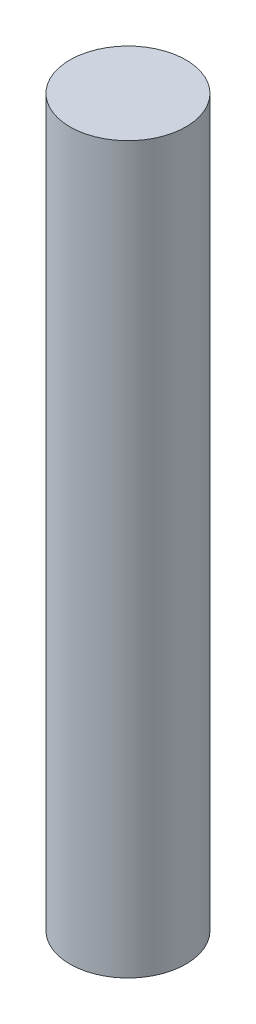
ISO-10303-21;
HEADER;
FILE_DESCRIPTION(('STEP AP214'),'2;1');
FILE_NAME('part.step','',(''),(''),'','','');
FILE_SCHEMA(('AUTOMOTIVE_DESIGN { 1 0 10303 214 1 1 1 1 }'));
ENDSEC;
DATA;
#1=APPLICATION_CONTEXT('core data for automotive mechanical design processes');
#2=APPLICATION_PROTOCOL_DEFINITION('international standard','automotive_design',2000,#1);
#3=PRODUCT_CONTEXT('',#1,'mechanical');
#4=PRODUCT('Part','Part','',(#3));
#5=PRODUCT_RELATED_PRODUCT_CATEGORY('part','',(#4));
#6=PRODUCT_DEFINITION_FORMATION('','',#4);
#7=PRODUCT_DEFINITION_CONTEXT('part definition',#1,'design');
#8=PRODUCT_DEFINITION('design','',#6,#7);
#9=PRODUCT_DEFINITION_SHAPE('','',#8);
#10=(LENGTH_UNIT() NAMED_UNIT(*) SI_UNIT(.MILLI.,.METRE.));
#11=(NAMED_UNIT(*) PLANE_ANGLE_UNIT() SI_UNIT($,.RADIAN.));
#12=(NAMED_UNIT(*) SI_UNIT($,.STERADIAN.) SOLID_ANGLE_UNIT());
#13=UNCERTAINTY_MEASURE_WITH_UNIT(LENGTH_MEASURE(1.E-05),#10,'distance_accuracy_value','');
#14=(GEOMETRIC_REPRESENTATION_CONTEXT(3) GLOBAL_UNCERTAINTY_ASSIGNED_CONTEXT((#13)) GLOBAL_UNIT_ASSIGNED_CONTEXT((#10,
#11,#12)) REPRESENTATION_CONTEXT('',''));
#15=CARTESIAN_POINT('',(0.,0.,0.));
#16=DIRECTION('',(0.,0.,1.));
#17=DIRECTION('',(1.,0.,0.));
#18=AXIS2_PLACEMENT_3D('',#15,#16,#17);
#19=CARTESIAN_POINT('',(0.,57.15,0.));
#20=DIRECTION('',(0.,-1.,0.));
#21=DIRECTION('',(0.,0.,-1.));
#22=AXIS2_PLACEMENT_3D('',#19,#20,#21);
#23=CYLINDRICAL_SURFACE('',#22,4.572);
#24=CARTESIAN_POINT('',(0.,57.15,0.));
#25=DIRECTION('',(0.,1.,0.));
#26=DIRECTION('',(0.,0.,1.));
#27=AXIS2_PLACEMENT_3D('',#24,#25,#26);
#28=CIRCLE('',#27,4.572);
#29=CARTESIAN_POINT('',(0.,57.15,4.572));
#30=VERTEX_POINT('',#29);
#31=EDGE_CURVE('E10',#30,#30,#28,.T.);
#32=ORIENTED_EDGE('',*,*,#31,.F.);
#33=EDGE_LOOP('',(#32));
#34=FACE_BOUND('',#33,.T.);
#35=CARTESIAN_POINT('',(0.,0.,0.));
#36=DIRECTION('',(0.,1.,0.));
#37=DIRECTION('',(0.,0.,1.));
#38=AXIS2_PLACEMENT_3D('',#35,#36,#37);
#39=CIRCLE('',#38,4.572);
#40=CARTESIAN_POINT('',(0.,0.,4.572));
#41=VERTEX_POINT('',#40);
#42=EDGE_CURVE('E38',#41,#41,#39,.T.);
#43=ORIENTED_EDGE('',*,*,#42,.T.);
#44=EDGE_LOOP('',(#43));
#45=FACE_BOUND('',#44,.T.);
#46=ADVANCED_FACE('F35',(#34,#45),#23,.T.);
#47=CARTESIAN_POINT('',(0.,57.15,0.));
#48=DIRECTION('',(0.,1.,0.));
#49=DIRECTION('',(0.,0.,1.));
#50=AXIS2_PLACEMENT_3D('',#47,#48,#49);
#51=PLANE('',#50);
#52=ORIENTED_EDGE('',*,*,#31,.T.);
#53=EDGE_LOOP('',(#52));
#54=FACE_BOUND('',#53,.T.);
#55=ADVANCED_FACE('F50',(#54),#51,.T.);
#56=CARTESIAN_POINT('',(0.,0.,0.));
#57=DIRECTION('',(0.,1.,0.));
#58=DIRECTION('',(0.,0.,1.));
#59=AXIS2_PLACEMENT_3D('',#56,#57,#58);
#60=PLANE('',#59);
#61=ORIENTED_EDGE('',*,*,#42,.F.);
#62=EDGE_LOOP('',(#61));
#63=FACE_BOUND('',#62,.T.);
#64=ADVANCED_FACE('F48',(#63),#60,.F.);
#65=CLOSED_SHELL('',(#46,#55,#64));
#66=MANIFOLD_SOLID_BREP('B2',#65);
#67=ADVANCED_BREP_SHAPE_REPRESENTATION('',(#18,#66),#14);
#68=SHAPE_DEFINITION_REPRESENTATION(#9,#67);
ENDSEC;
END-ISO-10303-21;
